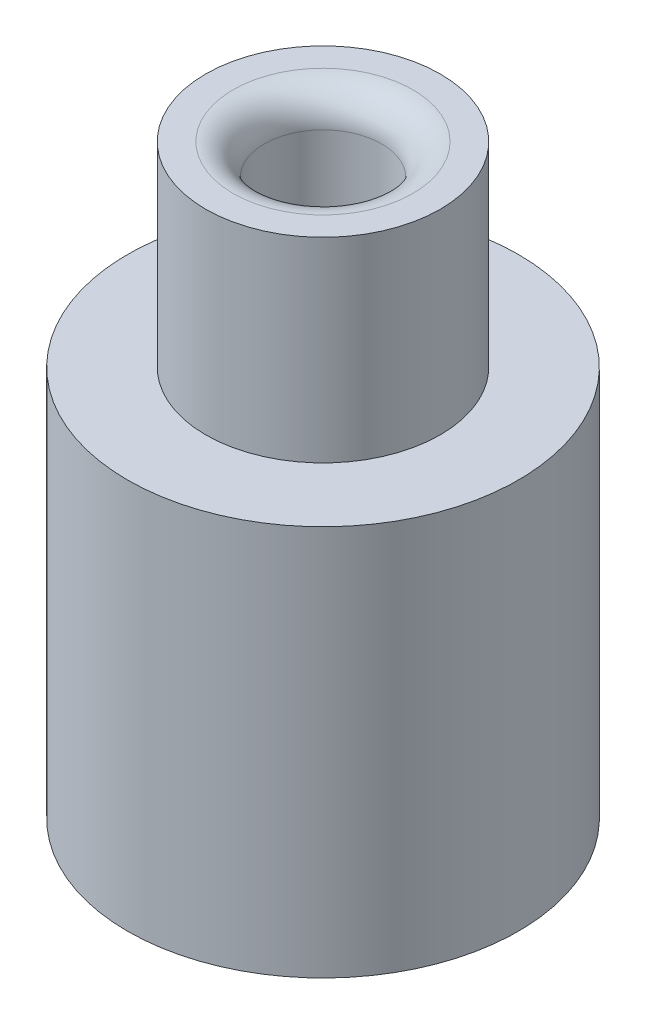
ISO-10303-21;
HEADER;
FILE_DESCRIPTION(('STEP AP214'),'2;1');
FILE_NAME('part.step','',(''),(''),'','','');
FILE_SCHEMA(('AUTOMOTIVE_DESIGN { 1 0 10303 214 1 1 1 1 }'));
ENDSEC;
DATA;
#1=APPLICATION_CONTEXT('core data for automotive mechanical design processes');
#2=APPLICATION_PROTOCOL_DEFINITION('international standard','automotive_design',2000,#1);
#3=PRODUCT_CONTEXT('',#1,'mechanical');
#4=PRODUCT('Part','Part','',(#3));
#5=PRODUCT_RELATED_PRODUCT_CATEGORY('part','',(#4));
#6=PRODUCT_DEFINITION_FORMATION('','',#4);
#7=PRODUCT_DEFINITION_CONTEXT('part definition',#1,'design');
#8=PRODUCT_DEFINITION('design','',#6,#7);
#9=PRODUCT_DEFINITION_SHAPE('','',#8);
#10=(LENGTH_UNIT() NAMED_UNIT(*) SI_UNIT(.MILLI.,.METRE.));
#11=(NAMED_UNIT(*) PLANE_ANGLE_UNIT() SI_UNIT($,.RADIAN.));
#12=(NAMED_UNIT(*) SI_UNIT($,.STERADIAN.) SOLID_ANGLE_UNIT());
#13=UNCERTAINTY_MEASURE_WITH_UNIT(LENGTH_MEASURE(1.E-05),#10,'distance_accuracy_value','');
#14=(GEOMETRIC_REPRESENTATION_CONTEXT(3) GLOBAL_UNCERTAINTY_ASSIGNED_CONTEXT((#13)) GLOBAL_UNIT_ASSIGNED_CONTEXT((#10,
#11,#12)) REPRESENTATION_CONTEXT('',''));
#15=CARTESIAN_POINT('',(0.,0.,0.));
#16=DIRECTION('',(0.,0.,1.));
#17=DIRECTION('',(1.,0.,0.));
#18=AXIS2_PLACEMENT_3D('',#15,#16,#17);
#19=CARTESIAN_POINT('',(0.,-4.,0.));
#20=DIRECTION('',(0.,1.,0.));
#21=DIRECTION('',(0.,0.,1.));
#22=AXIS2_PLACEMENT_3D('',#19,#20,#21);
#23=CYLINDRICAL_SURFACE('',#22,5.);
#24=CARTESIAN_POINT('',(0.,-4.,0.));
#25=DIRECTION('',(0.,1.,0.));
#26=DIRECTION('',(0.,0.,1.));
#27=AXIS2_PLACEMENT_3D('',#24,#25,#26);
#28=CIRCLE('',#27,5.);
#29=CARTESIAN_POINT('',(0.,-4.,5.));
#30=VERTEX_POINT('',#29);
#31=EDGE_CURVE('E46',#30,#30,#28,.T.);
#32=ORIENTED_EDGE('',*,*,#31,.T.);
#33=EDGE_LOOP('',(#32));
#34=FACE_BOUND('',#33,.T.);
#35=CARTESIAN_POINT('',(0.,6.,0.));
#36=DIRECTION('',(0.,1.,0.));
#37=DIRECTION('',(0.,0.,1.));
#38=AXIS2_PLACEMENT_3D('',#35,#36,#37);
#39=CIRCLE('',#38,5.);
#40=CARTESIAN_POINT('',(0.,6.,5.));
#41=VERTEX_POINT('',#40);
#42=EDGE_CURVE('E51',#41,#41,#39,.T.);
#43=ORIENTED_EDGE('',*,*,#42,.F.);
#44=EDGE_LOOP('',(#43));
#45=FACE_BOUND('',#44,.T.);
#46=ADVANCED_FACE('F31',(#34,#45),#23,.T.);
#47=CARTESIAN_POINT('',(0.,-4.,0.));
#48=DIRECTION('',(0.,1.,0.));
#49=DIRECTION('',(0.,0.,1.));
#50=AXIS2_PLACEMENT_3D('',#47,#48,#49);
#51=PLANE('',#50);
#52=CARTESIAN_POINT('',(0.,-4.,0.));
#53=DIRECTION('',(0.,-1.,0.));
#54=DIRECTION('',(0.,0.,-1.));
#55=AXIS2_PLACEMENT_3D('',#52,#53,#54);
#56=CIRCLE('',#55,2.5);
#57=CARTESIAN_POINT('',(0.,-4.,-2.5));
#58=VERTEX_POINT('',#57);
#59=EDGE_CURVE('E61',#58,#58,#56,.T.);
#60=ORIENTED_EDGE('',*,*,#59,.F.);
#61=EDGE_LOOP('',(#60));
#62=FACE_BOUND('',#61,.T.);
#63=ORIENTED_EDGE('',*,*,#31,.F.);
#64=EDGE_LOOP('',(#63));
#65=FACE_BOUND('',#64,.T.);
#66=ADVANCED_FACE('F76',(#62,#65),#51,.F.);
#67=CARTESIAN_POINT('',(0.,6.,0.));
#68=DIRECTION('',(0.,1.,0.));
#69=DIRECTION('',(0.,0.,1.));
#70=AXIS2_PLACEMENT_3D('',#67,#68,#69);
#71=PLANE('',#70);
#72=CARTESIAN_POINT('',(0.,6.,0.));
#73=DIRECTION('',(0.,1.,0.));
#74=DIRECTION('',(0.,0.,1.));
#75=AXIS2_PLACEMENT_3D('',#72,#73,#74);
#76=CIRCLE('',#75,3.);
#77=CARTESIAN_POINT('',(0.,6.,3.));
#78=VERTEX_POINT('',#77);
#79=EDGE_CURVE('E42',#78,#78,#76,.T.);
#80=ORIENTED_EDGE('',*,*,#79,.F.);
#81=EDGE_LOOP('',(#80));
#82=FACE_BOUND('',#81,.T.);
#83=ORIENTED_EDGE('',*,*,#42,.T.);
#84=EDGE_LOOP('',(#83));
#85=FACE_BOUND('',#84,.T.);
#86=ADVANCED_FACE('F79',(#82,#85),#71,.T.);
#87=CARTESIAN_POINT('',(0.,5.,0.));
#88=DIRECTION('',(0.,1.,0.));
#89=DIRECTION('',(0.,0.,1.));
#90=AXIS2_PLACEMENT_3D('',#87,#88,#89);
#91=CYLINDRICAL_SURFACE('',#90,3.);
#92=ORIENTED_EDGE('',*,*,#79,.T.);
#93=EDGE_LOOP('',(#92));
#94=FACE_BOUND('',#93,.T.);
#95=CARTESIAN_POINT('',(0.,11.,0.));
#96=DIRECTION('',(0.,1.,0.));
#97=DIRECTION('',(0.,0.,1.));
#98=AXIS2_PLACEMENT_3D('',#95,#96,#97);
#99=CIRCLE('',#98,3.);
#100=CARTESIAN_POINT('',(0.,11.,3.));
#101=VERTEX_POINT('',#100);
#102=EDGE_CURVE('E54',#101,#101,#99,.T.);
#103=ORIENTED_EDGE('',*,*,#102,.F.);
#104=EDGE_LOOP('',(#103));
#105=FACE_BOUND('',#104,.T.);
#106=ADVANCED_FACE('F88',(#94,#105),#91,.T.);
#107=CARTESIAN_POINT('',(0.,11.,0.));
#108=DIRECTION('',(0.,1.,0.));
#109=DIRECTION('',(0.,0.,1.));
#110=AXIS2_PLACEMENT_3D('',#107,#108,#109);
#111=PLANE('',#110);
#112=CARTESIAN_POINT('',(0.,11.,0.));
#113=DIRECTION('',(0.,1.,0.));
#114=DIRECTION('',(0.,0.,1.));
#115=AXIS2_PLACEMENT_3D('',#112,#113,#114);
#116=CIRCLE('',#115,2.3);
#117=CARTESIAN_POINT('',(0.,11.,2.3));
#118=VERTEX_POINT('',#117);
#119=EDGE_CURVE('E10',#118,#118,#116,.F.);
#120=ORIENTED_EDGE('',*,*,#119,.T.);
#121=EDGE_LOOP('',(#120));
#122=FACE_BOUND('',#121,.T.);
#123=ORIENTED_EDGE('',*,*,#102,.T.);
#124=EDGE_LOOP('',(#123));
#125=FACE_BOUND('',#124,.T.);
#126=ADVANCED_FACE('F94',(#122,#125),#111,.T.);
#127=CARTESIAN_POINT('',(0.,0.999999999999999,0.));
#128=DIRECTION('',(0.,1.,0.));
#129=DIRECTION('',(0.,0.,1.));
#130=AXIS2_PLACEMENT_3D('',#127,#128,#129);
#131=CYLINDRICAL_SURFACE('',#130,1.5);
#132=CARTESIAN_POINT('',(0.,10.2,0.));
#133=DIRECTION('',(0.,1.,0.));
#134=DIRECTION('',(0.,0.,1.));
#135=AXIS2_PLACEMENT_3D('',#132,#133,#134);
#136=CIRCLE('',#135,1.5);
#137=CARTESIAN_POINT('',(0.,10.2,1.5));
#138=VERTEX_POINT('',#137);
#139=EDGE_CURVE('E38',#138,#138,#136,.T.);
#140=ORIENTED_EDGE('',*,*,#139,.T.);
#141=EDGE_LOOP('',(#140));
#142=FACE_BOUND('',#141,.T.);
#143=CARTESIAN_POINT('',(0.,1.,0.));
#144=DIRECTION('',(0.,-1.,0.));
#145=DIRECTION('',(0.,0.,-1.));
#146=AXIS2_PLACEMENT_3D('',#143,#144,#145);
#147=CIRCLE('',#146,1.5);
#148=CARTESIAN_POINT('',(0.,1.,-1.5));
#149=VERTEX_POINT('',#148);
#150=EDGE_CURVE('E57',#149,#149,#147,.F.);
#151=ORIENTED_EDGE('',*,*,#150,.F.);
#152=EDGE_LOOP('',(#151));
#153=FACE_BOUND('',#152,.T.);
#154=ADVANCED_FACE('F101',(#142,#153),#131,.F.);
#155=CARTESIAN_POINT('',(0.,1.,0.));
#156=DIRECTION('',(0.,-1.,0.));
#157=DIRECTION('',(0.,0.,-1.));
#158=AXIS2_PLACEMENT_3D('',#155,#156,#157);
#159=PLANE('',#158);
#160=CARTESIAN_POINT('',(0.,1.,0.));
#161=DIRECTION('',(0.,-1.,0.));
#162=DIRECTION('',(0.,0.,-1.));
#163=AXIS2_PLACEMENT_3D('',#160,#161,#162);
#164=CIRCLE('',#163,2.5);
#165=CARTESIAN_POINT('',(0.,1.,-2.5));
#166=VERTEX_POINT('',#165);
#167=EDGE_CURVE('E60',#166,#166,#164,.T.);
#168=ORIENTED_EDGE('',*,*,#167,.T.);
#169=EDGE_LOOP('',(#168));
#170=FACE_BOUND('',#169,.T.);
#171=ORIENTED_EDGE('',*,*,#150,.T.);
#172=EDGE_LOOP('',(#171));
#173=FACE_BOUND('',#172,.T.);
#174=ADVANCED_FACE('F67',(#170,#173),#159,.T.);
#175=CARTESIAN_POINT('',(0.,1.,0.));
#176=DIRECTION('',(0.,-1.,0.));
#177=DIRECTION('',(0.,0.,-1.));
#178=AXIS2_PLACEMENT_3D('',#175,#176,#177);
#179=CYLINDRICAL_SURFACE('',#178,2.5);
#180=ORIENTED_EDGE('',*,*,#167,.F.);
#181=EDGE_LOOP('',(#180));
#182=FACE_BOUND('',#181,.T.);
#183=ORIENTED_EDGE('',*,*,#59,.T.);
#184=EDGE_LOOP('',(#183));
#185=FACE_BOUND('',#184,.T.);
#186=ADVANCED_FACE('F70',(#182,#185),#179,.F.);
#187=CARTESIAN_POINT('',(0.,10.2,0.));
#188=DIRECTION('',(0.,1.,0.));
#189=DIRECTION('',(0.,0.,1.));
#190=AXIS2_PLACEMENT_3D('',#187,#188,#189);
#191=TOROIDAL_SURFACE('',#190,2.3,0.8);
#192=ORIENTED_EDGE('',*,*,#119,.F.);
#193=EDGE_LOOP('',(#192));
#194=FACE_BOUND('',#193,.T.);
#195=ORIENTED_EDGE('',*,*,#139,.F.);
#196=EDGE_LOOP('',(#195));
#197=FACE_BOUND('',#196,.T.);
#198=ADVANCED_FACE('F33',(#194,#197),#191,.T.);
#199=CLOSED_SHELL('',(#46,#66,#86,#106,#126,#154,#174,#186,#198));
#200=MANIFOLD_SOLID_BREP('B2',#199);
#201=ADVANCED_BREP_SHAPE_REPRESENTATION('',(#18,#200),#14);
#202=SHAPE_DEFINITION_REPRESENTATION(#9,#201);
ENDSEC;
END-ISO-10303-21;
